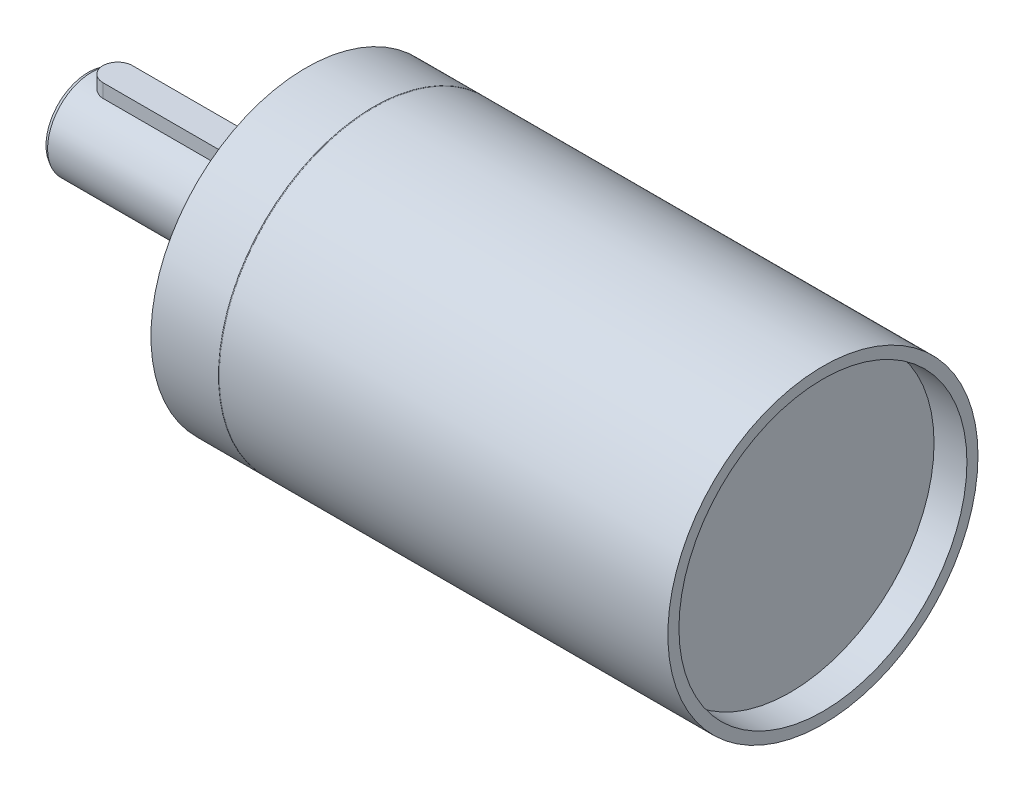
ISO-10303-21;
HEADER;
FILE_DESCRIPTION(('STEP AP214'),'2;1');
FILE_NAME('part.step','',(''),(''),'','','');
FILE_SCHEMA(('AUTOMOTIVE_DESIGN { 1 0 10303 214 1 1 1 1 }'));
ENDSEC;
DATA;
#1=APPLICATION_CONTEXT('core data for automotive mechanical design processes');
#2=APPLICATION_PROTOCOL_DEFINITION('international standard','automotive_design',2000,#1);
#3=PRODUCT_CONTEXT('',#1,'mechanical');
#4=PRODUCT('Part','Part','',(#3));
#5=PRODUCT_RELATED_PRODUCT_CATEGORY('part','',(#4));
#6=PRODUCT_DEFINITION_FORMATION('','',#4);
#7=PRODUCT_DEFINITION_CONTEXT('part definition',#1,'design');
#8=PRODUCT_DEFINITION('design','',#6,#7);
#9=PRODUCT_DEFINITION_SHAPE('','',#8);
#10=(LENGTH_UNIT() NAMED_UNIT(*) SI_UNIT(.MILLI.,.METRE.));
#11=(NAMED_UNIT(*) PLANE_ANGLE_UNIT() SI_UNIT($,.RADIAN.));
#12=(NAMED_UNIT(*) SI_UNIT($,.STERADIAN.) SOLID_ANGLE_UNIT());
#13=UNCERTAINTY_MEASURE_WITH_UNIT(LENGTH_MEASURE(1.E-05),#10,'distance_accuracy_value','');
#14=(GEOMETRIC_REPRESENTATION_CONTEXT(3) GLOBAL_UNCERTAINTY_ASSIGNED_CONTEXT((#13)) GLOBAL_UNIT_ASSIGNED_CONTEXT((#10,
#11,#12)) REPRESENTATION_CONTEXT('',''));
#15=CARTESIAN_POINT('',(0.,0.,0.));
#16=DIRECTION('',(0.,0.,1.));
#17=DIRECTION('',(1.,0.,0.));
#18=AXIS2_PLACEMENT_3D('',#15,#16,#17);
#19=CARTESIAN_POINT('',(-3.,0.,0.));
#20=DIRECTION('',(-1.,0.,0.));
#21=DIRECTION('',(0.,0.,1.));
#22=AXIS2_PLACEMENT_3D('',#19,#20,#21);
#23=PLANE('',#22);
#24=CARTESIAN_POINT('',(-3.,0.,0.));
#25=DIRECTION('',(-1.,0.,0.));
#26=DIRECTION('',(0.,0.,1.));
#27=AXIS2_PLACEMENT_3D('',#24,#25,#26);
#28=CIRCLE('',#27,14.);
#29=CARTESIAN_POINT('',(-3.,0.,14.));
#30=VERTEX_POINT('',#29);
#31=EDGE_CURVE('E288',#30,#30,#28,.T.);
#32=ORIENTED_EDGE('',*,*,#31,.T.);
#33=EDGE_LOOP('',(#32));
#34=FACE_BOUND('',#33,.T.);
#35=CARTESIAN_POINT('',(-3.,0.,0.));
#36=DIRECTION('',(-1.,0.,0.));
#37=DIRECTION('',(0.,0.,1.));
#38=AXIS2_PLACEMENT_3D('',#35,#36,#37);
#39=CIRCLE('',#38,6.);
#40=CARTESIAN_POINT('',(-3.,-5.99279677762809,-0.293916284085004));
#41=VERTEX_POINT('',#40);
#42=CARTESIAN_POINT('',(-3.,-5.99279677762809,0.293916284085002));
#43=VERTEX_POINT('',#42);
#44=EDGE_CURVE('E284',#41,#43,#39,.T.);
#45=ORIENTED_EDGE('',*,*,#44,.F.);
#46=DIRECTION('',(0.,1.,0.));
#47=VECTOR('',#46,1.);
#48=CARTESIAN_POINT('',(-3.,-5.99279677762809,-0.293916284085001));
#49=LINE('',#48,#47);
#50=CARTESIAN_POINT('',(-3.,-7.61683878137723,-0.293916284085002));
#51=VERTEX_POINT('',#50);
#52=EDGE_CURVE('E69',#51,#41,#49,.T.);
#53=ORIENTED_EDGE('',*,*,#52,.F.);
#54=CARTESIAN_POINT('',(-3.,-3.80484548733086,0.293916284084806));
#55=DIRECTION('',(-1.,0.,0.));
#56=DIRECTION('',(0.,0.,-1.));
#57=AXIS2_PLACEMENT_3D('',#54,#55,#56);
#58=CIRCLE('',#57,3.85705068699591);
#59=CARTESIAN_POINT('',(-3.,-5.99279677762799,-2.8825139690992));
#60=VERTEX_POINT('',#59);
#61=EDGE_CURVE('E263',#60,#51,#58,.T.);
#62=ORIENTED_EDGE('',*,*,#61,.F.);
#63=CARTESIAN_POINT('',(-3.,0.,0.));
#64=DIRECTION('',(-1.,0.,0.));
#65=DIRECTION('',(0.,0.,-1.));
#66=AXIS2_PLACEMENT_3D('',#63,#64,#65);
#67=CIRCLE('',#66,6.65000000000003);
#68=CARTESIAN_POINT('',(-3.,-5.99279677762799,2.88251396909925));
#69=VERTEX_POINT('',#68);
#70=EDGE_CURVE('E260',#69,#60,#67,.T.);
#71=ORIENTED_EDGE('',*,*,#70,.F.);
#72=CARTESIAN_POINT('',(-3.,-4.741805259079,0.293916284085));
#73=DIRECTION('',(-1.,0.,0.));
#74=DIRECTION('',(0.,0.,-1.));
#75=AXIS2_PLACEMENT_3D('',#72,#73,#74);
#76=CIRCLE('',#75,2.87503352229894);
#77=CARTESIAN_POINT('',(-3.,-7.616838781378,0.293916284085));
#78=VERTEX_POINT('',#77);
#79=EDGE_CURVE('E240',#78,#69,#76,.T.);
#80=ORIENTED_EDGE('',*,*,#79,.F.);
#81=DIRECTION('',(0.,-1.,0.));
#82=VECTOR('',#81,1.);
#83=CARTESIAN_POINT('',(-3.,-7.616838781378,0.293916284085));
#84=LINE('',#83,#82);
#85=EDGE_CURVE('E245',#43,#78,#84,.T.);
#86=ORIENTED_EDGE('',*,*,#85,.F.);
#87=EDGE_LOOP('',(#45,#53,#62,#71,#80,#86));
#88=FACE_BOUND('',#87,.T.);
#89=ADVANCED_FACE('F46',(#34,#88),#23,.T.);
#90=CARTESIAN_POINT('',(-29.5,0.,0.));
#91=DIRECTION('',(1.,0.,0.));
#92=DIRECTION('',(0.,0.,-1.));
#93=AXIS2_PLACEMENT_3D('',#90,#91,#92);
#94=CYLINDRICAL_SURFACE('',#93,6.);
#95=CARTESIAN_POINT('',(-29.0000000000346,0.,0.));
#96=DIRECTION('',(-1.,0.,0.));
#97=DIRECTION('',(0.,0.,1.));
#98=AXIS2_PLACEMENT_3D('',#95,#96,#97);
#99=CIRCLE('',#98,6.);
#100=CARTESIAN_POINT('',(-29.0000000000346,0.,6.));
#101=VERTEX_POINT('',#100);
#102=EDGE_CURVE('E13',#101,#101,#99,.F.);
#103=ORIENTED_EDGE('',*,*,#102,.T.);
#104=EDGE_LOOP('',(#103));
#105=FACE_BOUND('',#104,.T.);
#106=CARTESIAN_POINT('',(-25.5,5.65685424949238,-2.));
#107=CARTESIAN_POINT('',(-25.5545809936022,5.65684884188678,-2.0000014949184));
#108=CARTESIAN_POINT('',(-25.6091341243787,5.6576451988649,-1.99776424917478));
#109=CARTESIAN_POINT('',(-25.7178171681098,5.66078654578442,-1.9888512140728));
#110=CARTESIAN_POINT('',(-25.7719471913194,5.66313111768244,-1.98217662286705));
#111=CARTESIAN_POINT('',(-25.9327842863903,5.67238184449301,-1.95562135046158));
#112=CARTESIAN_POINT('',(-26.038361692541,5.6815058499903,-1.92920846605623));
#113=CARTESIAN_POINT('',(-26.2432503848876,5.70456149397718,-1.85991682366086));
#114=CARTESIAN_POINT('',(-26.3425650937458,5.71849047905858,-1.81704715197507));
#115=CARTESIAN_POINT('',(-26.5326796680109,5.74957574438921,-1.71614645792974));
#116=CARTESIAN_POINT('',(-26.6234742581347,5.76673400456216,-1.65810612564547));
#117=CARTESIAN_POINT('',(-26.7974404626491,5.80308960804095,-1.52610278704603));
#118=CARTESIAN_POINT('',(-26.8802297609252,5.82233755536618,-1.45164996064407));
#119=CARTESIAN_POINT('',(-27.0324120355834,5.86027697385956,-1.28997688598297));
#120=CARTESIAN_POINT('',(-27.1018026265119,5.87896834543705,-1.20275436910907));
#121=CARTESIAN_POINT('',(-27.2269590376084,5.91427765988454,-1.01520729191253));
#122=CARTESIAN_POINT('',(-27.2823219688045,5.93082875123708,-0.914600178716994));
#123=CARTESIAN_POINT('',(-27.3751845033745,5.95939217209317,-0.704858499931718));
#124=CARTESIAN_POINT('',(-27.4126895636409,5.97140588786619,-0.59572655118684));
#125=CARTESIAN_POINT('',(-27.4674714521827,5.98918142285845,-0.376058690956074));
#126=CARTESIAN_POINT('',(-27.4854065451074,5.99514617977147,-0.265703668920224));
#127=CARTESIAN_POINT('',(-27.5026325970512,6.00087216807634,-0.0433979389113466));
#128=CARTESIAN_POINT('',(-27.5019279985395,6.00063487762605,0.0685523824907838));
#129=CARTESIAN_POINT('',(-27.4823114337867,5.99412077270532,0.286207690558783));
#130=CARTESIAN_POINT('',(-27.4641147240811,5.98808121982527,0.391985405251071));
#131=CARTESIAN_POINT('',(-27.4112136026518,5.97093921001647,0.598888128753311));
#132=CARTESIAN_POINT('',(-27.3765082755875,5.95983647235462,0.700012879232927));
#133=CARTESIAN_POINT('',(-27.2911572607987,5.93351336542608,0.896305246061924));
#134=CARTESIAN_POINT('',(-27.2403079097553,5.91824075676625,0.991377011307983));
#135=CARTESIAN_POINT('',(-27.1242800972186,5.88516775360088,1.17184917819498));
#136=CARTESIAN_POINT('',(-27.059097737907,5.86736667195186,1.25724693942937));
#137=CARTESIAN_POINT('',(-26.9126579000063,5.83012543885479,1.42019467942243));
#138=CARTESIAN_POINT('',(-26.8307889127806,5.81064757359828,1.4971872232254));
#139=CARTESIAN_POINT('',(-26.6551170205677,5.77294980945702,1.63654404964077));
#140=CARTESIAN_POINT('',(-26.5613102751935,5.75473031831506,1.69890360636763));
#141=CARTESIAN_POINT('',(-26.3626396432934,5.72140062752635,1.80800665118557));
#142=CARTESIAN_POINT('',(-26.2576329701341,5.70634029896469,1.85450601901537));
#143=CARTESIAN_POINT('',(-26.0407060448201,5.68162194124078,1.92892046140223));
#144=CARTESIAN_POINT('',(-25.9287970132557,5.67195538817985,1.95686487211071));
#145=CARTESIAN_POINT('',(-25.763162726504,5.6627308418944,1.98331631256166));
#146=CARTESIAN_POINT('',(-25.7107172202915,5.66053335389204,1.98957012251023));
#147=CARTESIAN_POINT('',(-25.6055238432004,5.65759407142798,1.99790923214239));
#148=CARTESIAN_POINT('',(-25.5527764509112,5.65685039859056,1.99999991078996));
#149=CARTESIAN_POINT('',(-25.5,5.65685424949238,2.));
#150=B_SPLINE_CURVE_WITH_KNOTS('',3,(#106,#107,#108,#109,#110,#111,#112,#113,#114,#115,#116,
#117,#118,#119,#120,#121,#122,#123,#124,#125,#126,#127,#128,#129,#130,#131,#132,#133,#134,#135,
#136,#137,#138,#139,#140,#141,#142,#143,#144,#145,#146,#147,#148,#149),.UNSPECIFIED.,.F.,.F.,(4,
2,2,2,2,2,2,2,2,2,2,2,2,2,2,2,2,2,2,2,2,4),(0.,0.163636969470864,0.327229772338923,
0.653162396790745,0.97891532193247,1.30486862627062,1.64233009925355,1.97985159727495,
2.32618265866202,2.67240782242255,3.00658941454806,3.34069136061284,3.6616883693147,
3.98270317816496,4.30794037651935,4.63326613177537,4.97388108116101,5.31460588498485,
5.6603605985608,6.00556734973678,6.16399790665503,6.32222363058113),.UNSPECIFIED.);
#151=CARTESIAN_POINT('',(-25.5,5.65685424949238,-2.));
#152=VERTEX_POINT('',#151);
#153=CARTESIAN_POINT('',(-25.5,5.65685424949238,2.));
#154=VERTEX_POINT('',#153);
#155=EDGE_CURVE('E214',#152,#154,#150,.T.);
#156=ORIENTED_EDGE('',*,*,#155,.F.);
#157=DIRECTION('',(1.,0.,0.));
#158=VECTOR('',#157,1.);
#159=CARTESIAN_POINT('',(-29.5,5.65685424949238,-2.));
#160=LINE('',#159,#158);
#161=CARTESIAN_POINT('',(-9.5,5.65685424948015,-2.));
#162=VERTEX_POINT('',#161);
#163=EDGE_CURVE('E221',#162,#152,#160,.F.);
#164=ORIENTED_EDGE('',*,*,#163,.F.);
#165=CARTESIAN_POINT('',(-9.5,5.65685424949238,2.));
#166=CARTESIAN_POINT('',(-9.44541900639777,5.65684884188678,2.0000014949184));
#167=CARTESIAN_POINT('',(-9.39086587562134,5.6576451988649,1.99776424917478));
#168=CARTESIAN_POINT('',(-9.28218283189021,5.66078654578442,1.9888512140728));
#169=CARTESIAN_POINT('',(-9.22805280868061,5.66313111768244,1.98217662286705));
#170=CARTESIAN_POINT('',(-9.06721571360973,5.67238184449301,1.95562135046158));
#171=CARTESIAN_POINT('',(-8.96163830745905,5.6815058499903,1.92920846605623));
#172=CARTESIAN_POINT('',(-8.75674961511245,5.70456149397718,1.85991682366086));
#173=CARTESIAN_POINT('',(-8.65743490625416,5.71849047905858,1.81704715197507));
#174=CARTESIAN_POINT('',(-8.46732033198908,5.74957574438921,1.71614645792974));
#175=CARTESIAN_POINT('',(-8.37652574186531,5.76673400456216,1.65810612564547));
#176=CARTESIAN_POINT('',(-8.20255953735094,5.80308960804095,1.52610278704603));
#177=CARTESIAN_POINT('',(-8.11977023907478,5.82233755536618,1.45164996064408));
#178=CARTESIAN_POINT('',(-7.96758796441661,5.86027697385956,1.28997688598297));
#179=CARTESIAN_POINT('',(-7.89819737348812,5.87896834543705,1.20275436910907));
#180=CARTESIAN_POINT('',(-7.77304096239161,5.91427765988454,1.01520729191253));
#181=CARTESIAN_POINT('',(-7.71767803119549,5.93082875123708,0.914600178716996));
#182=CARTESIAN_POINT('',(-7.62481549662547,5.95939217209316,0.704858499931721));
#183=CARTESIAN_POINT('',(-7.58731043635913,5.97140588786619,0.595726551186843));
#184=CARTESIAN_POINT('',(-7.53252854781725,5.98918142285845,0.376058690956076));
#185=CARTESIAN_POINT('',(-7.51459345489264,5.99514617977147,0.265703668920226));
#186=CARTESIAN_POINT('',(-7.49736740294878,6.00087216807634,0.0433979389113482));
#187=CARTESIAN_POINT('',(-7.4980720014605,6.00063487762605,-0.0685523824907828));
#188=CARTESIAN_POINT('',(-7.51768856621331,5.99412077270532,-0.286207690558783));
#189=CARTESIAN_POINT('',(-7.53588527591893,5.98808121982527,-0.391985405251071));
#190=CARTESIAN_POINT('',(-7.58878639734824,5.97093921001647,-0.598888128753311));
#191=CARTESIAN_POINT('',(-7.6234917244125,5.95983647235462,-0.700012879232927));
#192=CARTESIAN_POINT('',(-7.70884273920126,5.93351336542608,-0.896305246061923));
#193=CARTESIAN_POINT('',(-7.75969209024468,5.91824075676625,-0.991377011307982));
#194=CARTESIAN_POINT('',(-7.8757199027814,5.88516775360088,-1.17184917819498));
#195=CARTESIAN_POINT('',(-7.94090226209303,5.86736667195186,-1.25724693942937));
#196=CARTESIAN_POINT('',(-8.08734209999369,5.83012543885479,-1.42019467942242));
#197=CARTESIAN_POINT('',(-8.16921108721941,5.81064757359828,-1.4971872232254));
#198=CARTESIAN_POINT('',(-8.34488297943233,5.77294980945702,-1.63654404964077));
#199=CARTESIAN_POINT('',(-8.43868972480648,5.75473031831506,-1.69890360636763));
#200=CARTESIAN_POINT('',(-8.63736035670656,5.72140062752635,-1.80800665118557));
#201=CARTESIAN_POINT('',(-8.74236702986588,5.70634029896469,-1.85450601901537));
#202=CARTESIAN_POINT('',(-8.95929395517991,5.68162194124078,-1.92892046140223));
#203=CARTESIAN_POINT('',(-9.0712029867443,5.67195538817985,-1.95686487211071));
#204=CARTESIAN_POINT('',(-9.23683727349596,5.6627308418944,-1.98331631256166));
#205=CARTESIAN_POINT('',(-9.28928277970846,5.66053335389204,-1.98957012251023));
#206=CARTESIAN_POINT('',(-9.39447615679962,5.65759407142798,-1.99790923214239));
#207=CARTESIAN_POINT('',(-9.44722354908881,5.65685039859056,-1.99999991078996));
#208=CARTESIAN_POINT('',(-9.5,5.65685424949238,-2.));
#209=B_SPLINE_CURVE_WITH_KNOTS('',3,(#165,#166,#167,#168,#169,#170,#171,#172,#173,#174,#175,
#176,#177,#178,#179,#180,#181,#182,#183,#184,#185,#186,#187,#188,#189,#190,#191,#192,#193,#194,
#195,#196,#197,#198,#199,#200,#201,#202,#203,#204,#205,#206,#207,#208),.UNSPECIFIED.,.F.,.F.,(4,
2,2,2,2,2,2,2,2,2,2,2,2,2,2,2,2,2,2,2,2,4),(0.,0.163636969470865,0.327229772338922,
0.653162396790745,0.978915321932472,1.30486862627062,1.64233009925355,1.97985159727495,
2.32618265866202,2.67240782242254,3.00658941454806,3.34069136061284,3.6616883693147,
3.98270317816496,4.30794037651935,4.63326613177537,4.973881081161,5.31460588498484,
5.6603605985608,6.00556734973678,6.16399790665503,6.32222363058113),.UNSPECIFIED.);
#210=CARTESIAN_POINT('',(-9.5,5.65685424948015,2.));
#211=VERTEX_POINT('',#210);
#212=EDGE_CURVE('E235',#211,#162,#209,.T.);
#213=ORIENTED_EDGE('',*,*,#212,.F.);
#214=DIRECTION('',(1.,0.,0.));
#215=VECTOR('',#214,1.);
#216=CARTESIAN_POINT('',(-29.5,5.65685424949238,2.));
#217=LINE('',#216,#215);
#218=EDGE_CURVE('E212',#154,#211,#217,.T.);
#219=ORIENTED_EDGE('',*,*,#218,.F.);
#220=EDGE_LOOP('',(#156,#164,#213,#219));
#221=FACE_BOUND('',#220,.T.);
#222=DIRECTION('',(1.,0.,0.));
#223=VECTOR('',#222,1.);
#224=CARTESIAN_POINT('',(-4.,-5.99279677762809,-0.293916284085004));
#225=LINE('',#224,#223);
#226=CARTESIAN_POINT('',(-4.,-5.99279677762809,-0.293916284085001));
#227=VERTEX_POINT('',#226);
#228=EDGE_CURVE('E273',#227,#41,#225,.T.);
#229=ORIENTED_EDGE('',*,*,#228,.T.);
#230=ORIENTED_EDGE('',*,*,#44,.T.);
#231=DIRECTION('',(1.,0.,0.));
#232=VECTOR('',#231,1.);
#233=CARTESIAN_POINT('',(-4.,-5.99279677762809,0.293916284085002));
#234=LINE('',#233,#232);
#235=CARTESIAN_POINT('',(-4.,-5.99279677762809,0.293916284085002));
#236=VERTEX_POINT('',#235);
#237=EDGE_CURVE('E270',#236,#43,#234,.T.);
#238=ORIENTED_EDGE('',*,*,#237,.F.);
#239=CARTESIAN_POINT('',(-4.,0.,0.));
#240=DIRECTION('',(1.,0.,0.));
#241=DIRECTION('',(0.,0.,1.));
#242=AXIS2_PLACEMENT_3D('',#239,#240,#241);
#243=CIRCLE('',#242,6.);
#244=EDGE_CURVE('E252',#227,#236,#243,.T.);
#245=ORIENTED_EDGE('',*,*,#244,.F.);
#246=EDGE_LOOP('',(#229,#230,#238,#245));
#247=FACE_BOUND('',#246,.T.);
#248=ADVANCED_FACE('F320',(#105,#221,#247),#94,.T.);
#249=CARTESIAN_POINT('',(0.,1.16808307098715E-12,0.));
#250=DIRECTION('',(1.,0.,0.));
#251=DIRECTION('',(0.,0.,-1.));
#252=AXIS2_PLACEMENT_3D('',#249,#250,#251);
#253=CYLINDRICAL_SURFACE('',#252,20.9999999999999);
#254=CARTESIAN_POINT('',(0.,1.16808307098715E-12,0.));
#255=DIRECTION('',(1.,0.,0.));
#256=DIRECTION('',(0.,0.,-1.));
#257=AXIS2_PLACEMENT_3D('',#254,#255,#256);
#258=CIRCLE('',#257,21.);
#259=CARTESIAN_POINT('',(0.,1.16808307098715E-12,-21.));
#260=VERTEX_POINT('',#259);
#261=EDGE_CURVE('E291',#260,#260,#258,.T.);
#262=ORIENTED_EDGE('',*,*,#261,.T.);
#263=EDGE_LOOP('',(#262));
#264=FACE_BOUND('',#263,.T.);
#265=CARTESIAN_POINT('',(9.15000000000059,1.16808307098715E-12,0.));
#266=DIRECTION('',(1.,0.,0.));
#267=DIRECTION('',(0.,0.,-1.));
#268=AXIS2_PLACEMENT_3D('',#265,#266,#267);
#269=CIRCLE('',#268,20.9999999999999);
#270=CARTESIAN_POINT('',(9.15000000000059,1.16808307098715E-12,-20.9999999999999));
#271=VERTEX_POINT('',#270);
#272=EDGE_CURVE('E302',#271,#271,#269,.T.);
#273=ORIENTED_EDGE('',*,*,#272,.F.);
#274=EDGE_LOOP('',(#273));
#275=FACE_BOUND('',#274,.T.);
#276=ADVANCED_FACE('F326',(#264,#275),#253,.T.);
#277=CARTESIAN_POINT('',(9.2,1.16920362280837E-12,0.));
#278=DIRECTION('',(1.,0.,0.));
#279=DIRECTION('',(0.,0.,-1.));
#280=AXIS2_PLACEMENT_3D('',#277,#278,#279);
#281=TOROIDAL_SURFACE('',#280,21.0866025403788,0.100000000000167);
#282=ORIENTED_EDGE('',*,*,#272,.T.);
#283=EDGE_LOOP('',(#282));
#284=FACE_BOUND('',#283,.T.);
#285=CARTESIAN_POINT('',(9.25,1.16808307098715E-12,0.));
#286=DIRECTION('',(1.,0.,0.));
#287=DIRECTION('',(0.,0.,-1.));
#288=AXIS2_PLACEMENT_3D('',#285,#286,#287);
#289=CIRCLE('',#288,21.);
#290=CARTESIAN_POINT('',(9.25,1.16808307098715E-12,-21.));
#291=VERTEX_POINT('',#290);
#292=EDGE_CURVE('E299',#291,#291,#289,.T.);
#293=ORIENTED_EDGE('',*,*,#292,.F.);
#294=EDGE_LOOP('',(#293));
#295=FACE_BOUND('',#294,.T.);
#296=ADVANCED_FACE('F346',(#284,#295),#281,.F.);
#297=CARTESIAN_POINT('',(0.,1.16808307098715E-12,0.));
#298=DIRECTION('',(1.,0.,0.));
#299=DIRECTION('',(0.,0.,-1.));
#300=AXIS2_PLACEMENT_3D('',#297,#298,#299);
#301=CYLINDRICAL_SURFACE('',#300,21.);
#302=ORIENTED_EDGE('',*,*,#292,.T.);
#303=EDGE_LOOP('',(#302));
#304=FACE_BOUND('',#303,.T.);
#305=CARTESIAN_POINT('',(70.,1.16808307098715E-12,0.));
#306=DIRECTION('',(1.,0.,0.));
#307=DIRECTION('',(0.,0.,-1.));
#308=AXIS2_PLACEMENT_3D('',#305,#306,#307);
#309=CIRCLE('',#308,21.);
#310=CARTESIAN_POINT('',(70.,1.16808307098715E-12,-21.));
#311=VERTEX_POINT('',#310);
#312=EDGE_CURVE('E296',#311,#311,#309,.T.);
#313=ORIENTED_EDGE('',*,*,#312,.F.);
#314=EDGE_LOOP('',(#313));
#315=FACE_BOUND('',#314,.T.);
#316=ADVANCED_FACE('F342',(#304,#315),#301,.T.);
#317=CARTESIAN_POINT('',(70.,1.16808307098715E-12,0.));
#318=DIRECTION('',(1.,0.,0.));
#319=DIRECTION('',(0.,0.,-1.));
#320=AXIS2_PLACEMENT_3D('',#317,#318,#319);
#321=PLANE('',#320);
#322=CARTESIAN_POINT('',(70.,0.,0.));
#323=DIRECTION('',(1.,0.,0.));
#324=DIRECTION('',(0.,0.,-1.));
#325=AXIS2_PLACEMENT_3D('',#322,#323,#324);
#326=CIRCLE('',#325,19.5);
#327=CARTESIAN_POINT('',(70.,0.,-19.5));
#328=VERTEX_POINT('',#327);
#329=EDGE_CURVE('E187',#328,#328,#326,.T.);
#330=ORIENTED_EDGE('',*,*,#329,.F.);
#331=EDGE_LOOP('',(#330));
#332=FACE_BOUND('',#331,.T.);
#333=ORIENTED_EDGE('',*,*,#312,.T.);
#334=EDGE_LOOP('',(#333));
#335=FACE_BOUND('',#334,.T.);
#336=ADVANCED_FACE('F338',(#332,#335),#321,.T.);
#337=CARTESIAN_POINT('',(0.,21.0000000000012,0.));
#338=DIRECTION('',(-1.,0.,0.));
#339=DIRECTION('',(0.,0.,1.));
#340=AXIS2_PLACEMENT_3D('',#337,#338,#339);
#341=PLANE('',#340);
#342=CARTESIAN_POINT('',(0.,17.49999999997,3.054326190989E-05));
#343=DIRECTION('',(-1.,0.,0.));
#344=DIRECTION('',(0.,0.,1.));
#345=AXIS2_PLACEMENT_3D('',#342,#343,#344);
#346=CIRCLE('',#345,1.64999999999999);
#347=CARTESIAN_POINT('',(0.,17.49999999997,1.6500305432619));
#348=VERTEX_POINT('',#347);
#349=EDGE_CURVE('E150',#348,#348,#346,.T.);
#350=ORIENTED_EDGE('',*,*,#349,.F.);
#351=EDGE_LOOP('',(#350));
#352=FACE_BOUND('',#351,.T.);
#353=CARTESIAN_POINT('',(0.,-3.054326190881E-05,17.49999999997));
#354=DIRECTION('',(-1.,0.,0.));
#355=DIRECTION('',(0.,0.,1.));
#356=AXIS2_PLACEMENT_3D('',#353,#354,#355);
#357=CIRCLE('',#356,1.64999999999999);
#358=CARTESIAN_POINT('',(0.,-3.054326190881E-05,19.14999999997));
#359=VERTEX_POINT('',#358);
#360=EDGE_CURVE('E163',#359,#359,#357,.T.);
#361=ORIENTED_EDGE('',*,*,#360,.F.);
#362=EDGE_LOOP('',(#361));
#363=FACE_BOUND('',#362,.T.);
#364=CARTESIAN_POINT('',(0.,-17.49999999997,-3.054326190774E-05));
#365=DIRECTION('',(-1.,0.,0.));
#366=DIRECTION('',(0.,0.,1.));
#367=AXIS2_PLACEMENT_3D('',#364,#365,#366);
#368=CIRCLE('',#367,1.64999999999999);
#369=CARTESIAN_POINT('',(0.,-17.49999999997,1.64996945673808));
#370=VERTEX_POINT('',#369);
#371=EDGE_CURVE('E169',#370,#370,#368,.T.);
#372=ORIENTED_EDGE('',*,*,#371,.F.);
#373=EDGE_LOOP('',(#372));
#374=FACE_BOUND('',#373,.T.);
#375=CARTESIAN_POINT('',(0.,3.054326190667E-05,-17.49999999997));
#376=DIRECTION('',(-1.,0.,0.));
#377=DIRECTION('',(0.,0.,1.));
#378=AXIS2_PLACEMENT_3D('',#375,#376,#377);
#379=CIRCLE('',#378,1.64999999999999);
#380=CARTESIAN_POINT('',(0.,3.054326190667E-05,-15.84999999997));
#381=VERTEX_POINT('',#380);
#382=EDGE_CURVE('E175',#381,#381,#379,.T.);
#383=ORIENTED_EDGE('',*,*,#382,.F.);
#384=EDGE_LOOP('',(#383));
#385=FACE_BOUND('',#384,.T.);
#386=CARTESIAN_POINT('',(0.,18.01565088397,-7.462326931119));
#387=DIRECTION('',(-1.,0.,0.));
#388=DIRECTION('',(0.,0.,1.));
#389=AXIS2_PLACEMENT_3D('',#386,#387,#388);
#390=CIRCLE('',#389,0.74999999999999);
#391=CARTESIAN_POINT('',(0.,18.01565088397,-6.71232693111901));
#392=VERTEX_POINT('',#391);
#393=EDGE_CURVE('E181',#392,#392,#390,.T.);
#394=ORIENTED_EDGE('',*,*,#393,.F.);
#395=EDGE_LOOP('',(#394));
#396=FACE_BOUND('',#395,.T.);
#397=CARTESIAN_POINT('',(0.,0.,0.));
#398=DIRECTION('',(-1.,0.,0.));
#399=DIRECTION('',(0.,0.,1.));
#400=AXIS2_PLACEMENT_3D('',#397,#398,#399);
#401=CIRCLE('',#400,14.);
#402=CARTESIAN_POINT('',(0.,0.,14.));
#403=VERTEX_POINT('',#402);
#404=EDGE_CURVE('E287',#403,#403,#401,.T.);
#405=ORIENTED_EDGE('',*,*,#404,.F.);
#406=EDGE_LOOP('',(#405));
#407=FACE_BOUND('',#406,.T.);
#408=ORIENTED_EDGE('',*,*,#261,.F.);
#409=EDGE_LOOP('',(#408));
#410=FACE_BOUND('',#409,.T.);
#411=ADVANCED_FACE('F334',(#352,#363,#374,#385,#396,#407,#410),#341,.T.);
#412=CARTESIAN_POINT('',(-3.,0.,0.));
#413=DIRECTION('',(1.,0.,0.));
#414=DIRECTION('',(0.,0.,-1.));
#415=AXIS2_PLACEMENT_3D('',#412,#413,#414);
#416=CYLINDRICAL_SURFACE('',#415,14.);
#417=ORIENTED_EDGE('',*,*,#31,.F.);
#418=EDGE_LOOP('',(#417));
#419=FACE_BOUND('',#418,.T.);
#420=ORIENTED_EDGE('',*,*,#404,.T.);
#421=EDGE_LOOP('',(#420));
#422=FACE_BOUND('',#421,.T.);
#423=ADVANCED_FACE('F331',(#419,#422),#416,.T.);
#424=CARTESIAN_POINT('',(-29.5,0.,0.));
#425=DIRECTION('',(-1.,0.,0.));
#426=DIRECTION('',(0.,0.,1.));
#427=AXIS2_PLACEMENT_3D('',#424,#425,#426);
#428=PLANE('',#427);
#429=CARTESIAN_POINT('',(-29.5,0.,0.));
#430=DIRECTION('',(-1.,0.,0.));
#431=DIRECTION('',(0.,0.,1.));
#432=AXIS2_PLACEMENT_3D('',#429,#430,#431);
#433=CIRCLE('',#432,5.71132486542906);
#434=CARTESIAN_POINT('',(-29.5,0.,5.71132486542906));
#435=VERTEX_POINT('',#434);
#436=EDGE_CURVE('E54',#435,#435,#433,.T.);
#437=ORIENTED_EDGE('',*,*,#436,.T.);
#438=EDGE_LOOP('',(#437));
#439=FACE_BOUND('',#438,.T.);
#440=CARTESIAN_POINT('',(-29.5,0.,0.));
#441=DIRECTION('',(-1.,0.,0.));
#442=DIRECTION('',(0.,0.,1.));
#443=AXIS2_PLACEMENT_3D('',#440,#441,#442);
#444=CIRCLE('',#443,1.32500000000846);
#445=CARTESIAN_POINT('',(-29.5,0.,1.32500000000846));
#446=VERTEX_POINT('',#445);
#447=EDGE_CURVE('E157',#446,#446,#444,.T.);
#448=ORIENTED_EDGE('',*,*,#447,.F.);
#449=EDGE_LOOP('',(#448));
#450=FACE_BOUND('',#449,.T.);
#451=ADVANCED_FACE('F307',(#439,#450),#428,.T.);
#452=CARTESIAN_POINT('',(-4.,-4.741805259079,0.293916284085));
#453=DIRECTION('',(1.,0.,0.));
#454=DIRECTION('',(0.,0.,-1.));
#455=AXIS2_PLACEMENT_3D('',#452,#453,#454);
#456=CYLINDRICAL_SURFACE('',#455,2.87503352229894);
#457=ORIENTED_EDGE('',*,*,#79,.T.);
#458=DIRECTION('',(1.,0.,0.));
#459=VECTOR('',#458,1.);
#460=CARTESIAN_POINT('',(-4.,-5.99279677762798,2.88251396909922));
#461=LINE('',#460,#459);
#462=CARTESIAN_POINT('',(-4.,-5.99279677762798,2.88251396909922));
#463=VERTEX_POINT('',#462);
#464=EDGE_CURVE('E281',#463,#69,#461,.T.);
#465=ORIENTED_EDGE('',*,*,#464,.F.);
#466=CARTESIAN_POINT('',(-4.,-4.741805259079,0.293916284085));
#467=DIRECTION('',(-1.,0.,0.));
#468=DIRECTION('',(0.,0.,-1.));
#469=AXIS2_PLACEMENT_3D('',#466,#467,#468);
#470=CIRCLE('',#469,2.87503352229894);
#471=CARTESIAN_POINT('',(-4.,-7.616838781378,0.293916284085));
#472=VERTEX_POINT('',#471);
#473=EDGE_CURVE('E241',#472,#463,#470,.T.);
#474=ORIENTED_EDGE('',*,*,#473,.F.);
#475=DIRECTION('',(1.,0.,0.));
#476=VECTOR('',#475,1.);
#477=CARTESIAN_POINT('',(-4.,-7.616838781378,0.293916284085));
#478=LINE('',#477,#476);
#479=EDGE_CURVE('E257',#472,#78,#478,.T.);
#480=ORIENTED_EDGE('',*,*,#479,.T.);
#481=EDGE_LOOP('',(#457,#465,#474,#480));
#482=FACE_BOUND('',#481,.T.);
#483=ADVANCED_FACE('F395',(#482),#456,.T.);
#484=CARTESIAN_POINT('',(-4.,0.,0.));
#485=DIRECTION('',(1.,0.,0.));
#486=DIRECTION('',(0.,0.,-1.));
#487=AXIS2_PLACEMENT_3D('',#484,#485,#486);
#488=CYLINDRICAL_SURFACE('',#487,6.65000000000003);
#489=ORIENTED_EDGE('',*,*,#70,.T.);
#490=DIRECTION('',(1.,0.,0.));
#491=VECTOR('',#490,1.);
#492=CARTESIAN_POINT('',(-4.,-5.992796777628,-2.88251396909921));
#493=LINE('',#492,#491);
#494=CARTESIAN_POINT('',(-4.,-5.992796777628,-2.88251396909921));
#495=VERTEX_POINT('',#494);
#496=EDGE_CURVE('E278',#495,#60,#493,.T.);
#497=ORIENTED_EDGE('',*,*,#496,.F.);
#498=CARTESIAN_POINT('',(-4.,0.,0.));
#499=DIRECTION('',(-1.,0.,0.));
#500=DIRECTION('',(0.,0.,-1.));
#501=AXIS2_PLACEMENT_3D('',#498,#499,#500);
#502=CIRCLE('',#501,6.65000000000003);
#503=EDGE_CURVE('E244',#463,#495,#502,.T.);
#504=ORIENTED_EDGE('',*,*,#503,.F.);
#505=ORIENTED_EDGE('',*,*,#464,.T.);
#506=EDGE_LOOP('',(#489,#497,#504,#505));
#507=FACE_BOUND('',#506,.T.);
#508=ADVANCED_FACE('F401',(#507),#488,.T.);
#509=CARTESIAN_POINT('',(-4.,-3.80484548733086,0.293916284084806));
#510=DIRECTION('',(1.,0.,0.));
#511=DIRECTION('',(0.,0.,-1.));
#512=AXIS2_PLACEMENT_3D('',#509,#510,#511);
#513=CYLINDRICAL_SURFACE('',#512,3.85705068699591);
#514=ORIENTED_EDGE('',*,*,#61,.T.);
#515=DIRECTION('',(1.,0.,0.));
#516=VECTOR('',#515,1.);
#517=CARTESIAN_POINT('',(-4.,-7.61683878137722,-0.293916284085));
#518=LINE('',#517,#516);
#519=CARTESIAN_POINT('',(-4.,-7.61683878137722,-0.293916284085));
#520=VERTEX_POINT('',#519);
#521=EDGE_CURVE('E275',#520,#51,#518,.T.);
#522=ORIENTED_EDGE('',*,*,#521,.F.);
#523=CARTESIAN_POINT('',(-4.,-3.80484548733086,0.293916284084806));
#524=DIRECTION('',(-1.,0.,0.));
#525=DIRECTION('',(0.,0.,-1.));
#526=AXIS2_PLACEMENT_3D('',#523,#524,#525);
#527=CIRCLE('',#526,3.85705068699591);
#528=EDGE_CURVE('E247',#495,#520,#527,.T.);
#529=ORIENTED_EDGE('',*,*,#528,.F.);
#530=ORIENTED_EDGE('',*,*,#496,.T.);
#531=EDGE_LOOP('',(#514,#522,#529,#530));
#532=FACE_BOUND('',#531,.T.);
#533=ADVANCED_FACE('F409',(#532),#513,.T.);
#534=CARTESIAN_POINT('',(-4.,-5.99279677762809,-0.293916284085001));
#535=DIRECTION('',(0.,0.,-1.));
#536=DIRECTION('',(0.,1.,0.));
#537=AXIS2_PLACEMENT_3D('',#534,#535,#536);
#538=PLANE('',#537);
#539=ORIENTED_EDGE('',*,*,#52,.T.);
#540=ORIENTED_EDGE('',*,*,#228,.F.);
#541=DIRECTION('',(0.,1.,0.));
#542=VECTOR('',#541,1.);
#543=CARTESIAN_POINT('',(-4.,-5.99279677762809,-0.293916284085001));
#544=LINE('',#543,#542);
#545=EDGE_CURVE('E249',#520,#227,#544,.T.);
#546=ORIENTED_EDGE('',*,*,#545,.F.);
#547=ORIENTED_EDGE('',*,*,#521,.T.);
#548=EDGE_LOOP('',(#539,#540,#546,#547));
#549=FACE_BOUND('',#548,.T.);
#550=ADVANCED_FACE('F417',(#549),#538,.F.);
#551=CARTESIAN_POINT('',(-4.,-7.616838781378,0.293916284085));
#552=DIRECTION('',(0.,0.,1.));
#553=DIRECTION('',(0.,-1.,0.));
#554=AXIS2_PLACEMENT_3D('',#551,#552,#553);
#555=PLANE('',#554);
#556=ORIENTED_EDGE('',*,*,#85,.T.);
#557=ORIENTED_EDGE('',*,*,#479,.F.);
#558=DIRECTION('',(0.,-1.,0.));
#559=VECTOR('',#558,1.);
#560=CARTESIAN_POINT('',(-4.,-7.616838781378,0.293916284085));
#561=LINE('',#560,#559);
#562=EDGE_CURVE('E255',#236,#472,#561,.T.);
#563=ORIENTED_EDGE('',*,*,#562,.F.);
#564=ORIENTED_EDGE('',*,*,#237,.T.);
#565=EDGE_LOOP('',(#556,#557,#563,#564));
#566=FACE_BOUND('',#565,.T.);
#567=ADVANCED_FACE('F425',(#566),#555,.F.);
#568=CARTESIAN_POINT('',(-4.,-4.741805259079,0.293916284085));
#569=DIRECTION('',(1.,0.,0.));
#570=DIRECTION('',(0.,0.,-1.));
#571=AXIS2_PLACEMENT_3D('',#568,#569,#570);
#572=PLANE('',#571);
#573=ORIENTED_EDGE('',*,*,#473,.T.);
#574=ORIENTED_EDGE('',*,*,#503,.T.);
#575=ORIENTED_EDGE('',*,*,#528,.T.);
#576=ORIENTED_EDGE('',*,*,#545,.T.);
#577=ORIENTED_EDGE('',*,*,#244,.T.);
#578=ORIENTED_EDGE('',*,*,#562,.T.);
#579=EDGE_LOOP('',(#573,#574,#575,#576,#577,#578));
#580=FACE_BOUND('',#579,.T.);
#581=ADVANCED_FACE('F232',(#580),#572,.F.);
#582=CARTESIAN_POINT('',(-9.5,-500000.,-2.));
#583=DIRECTION('',(0.,0.,-1.));
#584=DIRECTION('',(-1.,0.,0.));
#585=AXIS2_PLACEMENT_3D('',#582,#583,#584);
#586=PLANE('',#585);
#587=DIRECTION('',(0.,1.,0.));
#588=VECTOR('',#587,1.);
#589=CARTESIAN_POINT('',(-9.5,-500000.,-2.));
#590=LINE('',#589,#588);
#591=CARTESIAN_POINT('',(-9.5,7.5,-2.));
#592=VERTEX_POINT('',#591);
#593=EDGE_CURVE('E210',#162,#592,#590,.T.);
#594=ORIENTED_EDGE('',*,*,#593,.F.);
#595=ORIENTED_EDGE('',*,*,#163,.T.);
#596=DIRECTION('',(0.,1.,0.));
#597=VECTOR('',#596,1.);
#598=CARTESIAN_POINT('',(-25.5,-500000.,-2.));
#599=LINE('',#598,#597);
#600=CARTESIAN_POINT('',(-25.5,7.5,-2.));
#601=VERTEX_POINT('',#600);
#602=EDGE_CURVE('E208',#152,#601,#599,.T.);
#603=ORIENTED_EDGE('',*,*,#602,.T.);
#604=DIRECTION('',(-1.,0.,0.));
#605=VECTOR('',#604,1.);
#606=CARTESIAN_POINT('',(-9.5,7.5,-2.));
#607=LINE('',#606,#605);
#608=EDGE_CURVE('E194',#592,#601,#607,.T.);
#609=ORIENTED_EDGE('',*,*,#608,.F.);
#610=EDGE_LOOP('',(#594,#595,#603,#609));
#611=FACE_BOUND('',#610,.T.);
#612=ADVANCED_FACE('F439',(#611),#586,.T.);
#613=CARTESIAN_POINT('',(-9.5,7.5,0.));
#614=DIRECTION('',(0.,1.,0.));
#615=DIRECTION('',(0.,0.,1.));
#616=AXIS2_PLACEMENT_3D('',#613,#614,#615);
#617=PLANE('',#616);
#618=CARTESIAN_POINT('',(-9.5,7.5,0.));
#619=DIRECTION('',(0.,1.,0.));
#620=DIRECTION('',(0.,0.,1.));
#621=AXIS2_PLACEMENT_3D('',#618,#619,#620);
#622=CIRCLE('',#621,2.);
#623=CARTESIAN_POINT('',(-9.5,7.5,2.));
#624=VERTEX_POINT('',#623);
#625=EDGE_CURVE('E193',#624,#592,#622,.T.);
#626=ORIENTED_EDGE('',*,*,#625,.T.);
#627=ORIENTED_EDGE('',*,*,#608,.T.);
#628=CARTESIAN_POINT('',(-25.5,7.5,0.));
#629=DIRECTION('',(0.,1.,0.));
#630=DIRECTION('',(0.,0.,1.));
#631=AXIS2_PLACEMENT_3D('',#628,#629,#630);
#632=CIRCLE('',#631,2.);
#633=CARTESIAN_POINT('',(-25.5,7.5,2.));
#634=VERTEX_POINT('',#633);
#635=EDGE_CURVE('E197',#601,#634,#632,.T.);
#636=ORIENTED_EDGE('',*,*,#635,.T.);
#637=DIRECTION('',(1.,0.,0.));
#638=VECTOR('',#637,1.);
#639=CARTESIAN_POINT('',(-25.5,7.5,2.));
#640=LINE('',#639,#638);
#641=EDGE_CURVE('E200',#634,#624,#640,.T.);
#642=ORIENTED_EDGE('',*,*,#641,.T.);
#643=EDGE_LOOP('',(#626,#627,#636,#642));
#644=FACE_BOUND('',#643,.T.);
#645=ADVANCED_FACE('F447',(#644),#617,.T.);
#646=CARTESIAN_POINT('',(-9.5,-500000.,0.));
#647=DIRECTION('',(0.,1.,0.));
#648=DIRECTION('',(0.,0.,1.));
#649=AXIS2_PLACEMENT_3D('',#646,#647,#648);
#650=CYLINDRICAL_SURFACE('',#649,2.);
#651=DIRECTION('',(0.,1.,0.));
#652=VECTOR('',#651,1.);
#653=CARTESIAN_POINT('',(-9.5,-500000.,2.));
#654=LINE('',#653,#652);
#655=EDGE_CURVE('E203',#211,#624,#654,.T.);
#656=ORIENTED_EDGE('',*,*,#655,.F.);
#657=ORIENTED_EDGE('',*,*,#212,.T.);
#658=ORIENTED_EDGE('',*,*,#593,.T.);
#659=ORIENTED_EDGE('',*,*,#625,.F.);
#660=EDGE_LOOP('',(#656,#657,#658,#659));
#661=FACE_BOUND('',#660,.T.);
#662=ADVANCED_FACE('F230',(#661),#650,.T.);
#663=CARTESIAN_POINT('',(-25.5,-500000.,0.));
#664=DIRECTION('',(0.,1.,0.));
#665=DIRECTION('',(0.,0.,1.));
#666=AXIS2_PLACEMENT_3D('',#663,#664,#665);
#667=CYLINDRICAL_SURFACE('',#666,2.);
#668=ORIENTED_EDGE('',*,*,#602,.F.);
#669=ORIENTED_EDGE('',*,*,#155,.T.);
#670=DIRECTION('',(0.,1.,0.));
#671=VECTOR('',#670,1.);
#672=CARTESIAN_POINT('',(-25.5,-500000.,2.));
#673=LINE('',#672,#671);
#674=EDGE_CURVE('E61',#154,#634,#673,.T.);
#675=ORIENTED_EDGE('',*,*,#674,.T.);
#676=ORIENTED_EDGE('',*,*,#635,.F.);
#677=EDGE_LOOP('',(#668,#669,#675,#676));
#678=FACE_BOUND('',#677,.T.);
#679=ADVANCED_FACE('F223',(#678),#667,.T.);
#680=CARTESIAN_POINT('',(-25.5,-500000.,2.));
#681=DIRECTION('',(0.,0.,1.));
#682=DIRECTION('',(1.,0.,0.));
#683=AXIS2_PLACEMENT_3D('',#680,#681,#682);
#684=PLANE('',#683);
#685=ORIENTED_EDGE('',*,*,#674,.F.);
#686=ORIENTED_EDGE('',*,*,#218,.T.);
#687=ORIENTED_EDGE('',*,*,#655,.T.);
#688=ORIENTED_EDGE('',*,*,#641,.F.);
#689=EDGE_LOOP('',(#685,#686,#687,#688));
#690=FACE_BOUND('',#689,.T.);
#691=ADVANCED_FACE('F441',(#690),#684,.T.);
#692=CARTESIAN_POINT('',(65.55,0.,0.));
#693=DIRECTION('',(-1.,0.,0.));
#694=DIRECTION('',(0.,0.,1.));
#695=AXIS2_PLACEMENT_3D('',#692,#693,#694);
#696=PLANE('',#695);
#697=CARTESIAN_POINT('',(65.55,0.,0.));
#698=DIRECTION('',(1.,0.,0.));
#699=DIRECTION('',(0.,0.,-1.));
#700=AXIS2_PLACEMENT_3D('',#697,#698,#699);
#701=CIRCLE('',#700,19.5);
#702=CARTESIAN_POINT('',(65.55,0.,-19.5));
#703=VERTEX_POINT('',#702);
#704=EDGE_CURVE('E190',#703,#703,#701,.T.);
#705=ORIENTED_EDGE('',*,*,#704,.T.);
#706=EDGE_LOOP('',(#705));
#707=FACE_BOUND('',#706,.T.);
#708=ADVANCED_FACE('F449',(#707),#696,.F.);
#709=CARTESIAN_POINT('',(70.,0.,0.));
#710=DIRECTION('',(1.,0.,0.));
#711=DIRECTION('',(0.,0.,-1.));
#712=AXIS2_PLACEMENT_3D('',#709,#710,#711);
#713=CYLINDRICAL_SURFACE('',#712,19.5);
#714=ORIENTED_EDGE('',*,*,#704,.F.);
#715=EDGE_LOOP('',(#714));
#716=FACE_BOUND('',#715,.T.);
#717=ORIENTED_EDGE('',*,*,#329,.T.);
#718=EDGE_LOOP('',(#717));
#719=FACE_BOUND('',#718,.T.);
#720=ADVANCED_FACE('F477',(#716,#719),#713,.F.);
#721=CARTESIAN_POINT('',(2.,18.01565088397,-7.462326931119));
#722=DIRECTION('',(-1.,0.,0.));
#723=DIRECTION('',(0.,0.,1.));
#724=AXIS2_PLACEMENT_3D('',#721,#722,#723);
#725=CONICAL_SURFACE('',#724,0.749999999999987,1.02974425868404);
#726=CARTESIAN_POINT('',(2.45064546426313,18.01565088397,-7.462326931119));
#727=VERTEX_POINT('',#726);
#728=VERTEX_LOOP('',#727);
#729=FACE_BOUND('',#728,.T.);
#730=CARTESIAN_POINT('',(2.,18.01565088397,-7.462326931119));
#731=DIRECTION('',(-1.,0.,0.));
#732=DIRECTION('',(0.,0.,1.));
#733=AXIS2_PLACEMENT_3D('',#730,#731,#732);
#734=CIRCLE('',#733,0.749999999999987);
#735=CARTESIAN_POINT('',(2.,18.01565088397,-6.71232693111901));
#736=VERTEX_POINT('',#735);
#737=EDGE_CURVE('E184',#736,#736,#734,.T.);
#738=ORIENTED_EDGE('',*,*,#737,.T.);
#739=EDGE_LOOP('',(#738));
#740=FACE_BOUND('',#739,.T.);
#741=ADVANCED_FACE('F485',(#729,#740),#725,.F.);
#742=CARTESIAN_POINT('',(0.,18.01565088397,-7.462326931119));
#743=DIRECTION('',(-1.,0.,0.));
#744=DIRECTION('',(0.,0.,1.));
#745=AXIS2_PLACEMENT_3D('',#742,#743,#744);
#746=CYLINDRICAL_SURFACE('',#745,0.749999999999989);
#747=ORIENTED_EDGE('',*,*,#737,.F.);
#748=EDGE_LOOP('',(#747));
#749=FACE_BOUND('',#748,.T.);
#750=ORIENTED_EDGE('',*,*,#393,.T.);
#751=EDGE_LOOP('',(#750));
#752=FACE_BOUND('',#751,.T.);
#753=ADVANCED_FACE('F493',(#749,#752),#746,.F.);
#754=CARTESIAN_POINT('',(6.00000000000001,3.054326190667E-05,-17.49999999997));
#755=DIRECTION('',(-1.,0.,0.));
#756=DIRECTION('',(0.,0.,1.));
#757=AXIS2_PLACEMENT_3D('',#754,#755,#756);
#758=CONICAL_SURFACE('',#757,1.64999999999999,1.02974425866086);
#759=CARTESIAN_POINT('',(6.99142002143094,3.05432619049576E-05,-17.49999999997));
#760=VERTEX_POINT('',#759);
#761=VERTEX_LOOP('',#760);
#762=FACE_BOUND('',#761,.T.);
#763=CARTESIAN_POINT('',(6.00000000000001,3.054326190667E-05,-17.49999999997));
#764=DIRECTION('',(-1.,0.,0.));
#765=DIRECTION('',(0.,0.,1.));
#766=AXIS2_PLACEMENT_3D('',#763,#764,#765);
#767=CIRCLE('',#766,1.64999999999999);
#768=CARTESIAN_POINT('',(6.00000000000001,3.054326190667E-05,-15.84999999997));
#769=VERTEX_POINT('',#768);
#770=EDGE_CURVE('E178',#769,#769,#767,.T.);
#771=ORIENTED_EDGE('',*,*,#770,.T.);
#772=EDGE_LOOP('',(#771));
#773=FACE_BOUND('',#772,.T.);
#774=ADVANCED_FACE('F500',(#762,#773),#758,.F.);
#775=CARTESIAN_POINT('',(0.,3.054326190667E-05,-17.49999999997));
#776=DIRECTION('',(-1.,0.,0.));
#777=DIRECTION('',(0.,0.,1.));
#778=AXIS2_PLACEMENT_3D('',#775,#776,#777);
#779=CYLINDRICAL_SURFACE('',#778,1.64999999999999);
#780=ORIENTED_EDGE('',*,*,#770,.F.);
#781=EDGE_LOOP('',(#780));
#782=FACE_BOUND('',#781,.T.);
#783=ORIENTED_EDGE('',*,*,#382,.T.);
#784=EDGE_LOOP('',(#783));
#785=FACE_BOUND('',#784,.T.);
#786=ADVANCED_FACE('F507',(#782,#785),#779,.F.);
#787=CARTESIAN_POINT('',(6.00000000000001,-17.49999999997,-3.054326190774E-05));
#788=DIRECTION('',(-1.,0.,0.));
#789=DIRECTION('',(0.,0.,1.));
#790=AXIS2_PLACEMENT_3D('',#787,#788,#789);
#791=CONICAL_SURFACE('',#790,1.64999999999999,1.02974425866086);
#792=CARTESIAN_POINT('',(6.99142002143094,-17.49999999997,-3.054326190774E-05));
#793=VERTEX_POINT('',#792);
#794=VERTEX_LOOP('',#793);
#795=FACE_BOUND('',#794,.T.);
#796=CARTESIAN_POINT('',(6.00000000000001,-17.49999999997,-3.054326190774E-05));
#797=DIRECTION('',(-1.,0.,0.));
#798=DIRECTION('',(0.,0.,1.));
#799=AXIS2_PLACEMENT_3D('',#796,#797,#798);
#800=CIRCLE('',#799,1.64999999999999);
#801=CARTESIAN_POINT('',(6.00000000000001,-17.49999999997,1.64996945673808));
#802=VERTEX_POINT('',#801);
#803=EDGE_CURVE('E172',#802,#802,#800,.T.);
#804=ORIENTED_EDGE('',*,*,#803,.T.);
#805=EDGE_LOOP('',(#804));
#806=FACE_BOUND('',#805,.T.);
#807=ADVANCED_FACE('F515',(#795,#806),#791,.F.);
#808=CARTESIAN_POINT('',(0.,-17.49999999997,-3.054326190774E-05));
#809=DIRECTION('',(-1.,0.,0.));
#810=DIRECTION('',(0.,0.,1.));
#811=AXIS2_PLACEMENT_3D('',#808,#809,#810);
#812=CYLINDRICAL_SURFACE('',#811,1.64999999999999);
#813=ORIENTED_EDGE('',*,*,#803,.F.);
#814=EDGE_LOOP('',(#813));
#815=FACE_BOUND('',#814,.T.);
#816=ORIENTED_EDGE('',*,*,#371,.T.);
#817=EDGE_LOOP('',(#816));
#818=FACE_BOUND('',#817,.T.);
#819=ADVANCED_FACE('F523',(#815,#818),#812,.F.);
#820=CARTESIAN_POINT('',(6.00000000000001,-3.054326190881E-05,17.49999999997));
#821=DIRECTION('',(-1.,0.,0.));
#822=DIRECTION('',(0.,0.,1.));
#823=AXIS2_PLACEMENT_3D('',#820,#821,#822);
#824=CONICAL_SURFACE('',#823,1.64999999999999,1.02974425866086);
#825=CARTESIAN_POINT('',(6.99142002143094,-3.05432619105224E-05,17.49999999997));
#826=VERTEX_POINT('',#825);
#827=VERTEX_LOOP('',#826);
#828=FACE_BOUND('',#827,.T.);
#829=CARTESIAN_POINT('',(6.00000000000001,-3.054326190881E-05,17.49999999997));
#830=DIRECTION('',(-1.,0.,0.));
#831=DIRECTION('',(0.,0.,1.));
#832=AXIS2_PLACEMENT_3D('',#829,#830,#831);
#833=CIRCLE('',#832,1.64999999999999);
#834=CARTESIAN_POINT('',(6.00000000000001,-3.054326190881E-05,19.14999999997));
#835=VERTEX_POINT('',#834);
#836=EDGE_CURVE('E166',#835,#835,#833,.T.);
#837=ORIENTED_EDGE('',*,*,#836,.T.);
#838=EDGE_LOOP('',(#837));
#839=FACE_BOUND('',#838,.T.);
#840=ADVANCED_FACE('F531',(#828,#839),#824,.F.);
#841=CARTESIAN_POINT('',(0.,-3.054326190881E-05,17.49999999997));
#842=DIRECTION('',(-1.,0.,0.));
#843=DIRECTION('',(0.,0.,1.));
#844=AXIS2_PLACEMENT_3D('',#841,#842,#843);
#845=CYLINDRICAL_SURFACE('',#844,1.64999999999999);
#846=ORIENTED_EDGE('',*,*,#836,.F.);
#847=EDGE_LOOP('',(#846));
#848=FACE_BOUND('',#847,.T.);
#849=ORIENTED_EDGE('',*,*,#360,.T.);
#850=EDGE_LOOP('',(#849));
#851=FACE_BOUND('',#850,.T.);
#852=ADVANCED_FACE('F539',(#848,#851),#845,.F.);
#853=CARTESIAN_POINT('',(6.00000000000001,17.49999999997,3.054326190989E-05));
#854=DIRECTION('',(-1.,0.,0.));
#855=DIRECTION('',(0.,0.,1.));
#856=AXIS2_PLACEMENT_3D('',#853,#854,#855);
#857=CONICAL_SURFACE('',#856,1.64999999999999,1.02974425866086);
#858=CARTESIAN_POINT('',(6.99142002143094,17.49999999997,3.054326190989E-05));
#859=VERTEX_POINT('',#858);
#860=VERTEX_LOOP('',#859);
#861=FACE_BOUND('',#860,.T.);
#862=CARTESIAN_POINT('',(6.00000000000001,17.49999999997,3.054326190989E-05));
#863=DIRECTION('',(-1.,0.,0.));
#864=DIRECTION('',(0.,0.,1.));
#865=AXIS2_PLACEMENT_3D('',#862,#863,#864);
#866=CIRCLE('',#865,1.64999999999999);
#867=CARTESIAN_POINT('',(6.00000000000001,17.49999999997,1.6500305432619));
#868=VERTEX_POINT('',#867);
#869=EDGE_CURVE('E154',#868,#868,#866,.T.);
#870=ORIENTED_EDGE('',*,*,#869,.T.);
#871=EDGE_LOOP('',(#870));
#872=FACE_BOUND('',#871,.T.);
#873=ADVANCED_FACE('F547',(#861,#872),#857,.F.);
#874=CARTESIAN_POINT('',(0.,17.49999999997,3.054326190989E-05));
#875=DIRECTION('',(-1.,0.,0.));
#876=DIRECTION('',(0.,0.,1.));
#877=AXIS2_PLACEMENT_3D('',#874,#875,#876);
#878=CYLINDRICAL_SURFACE('',#877,1.64999999999999);
#879=ORIENTED_EDGE('',*,*,#869,.F.);
#880=EDGE_LOOP('',(#879));
#881=FACE_BOUND('',#880,.T.);
#882=ORIENTED_EDGE('',*,*,#349,.T.);
#883=EDGE_LOOP('',(#882));
#884=FACE_BOUND('',#883,.T.);
#885=ADVANCED_FACE('F144',(#881,#884),#878,.F.);
#886=CARTESIAN_POINT('',(-27.5608439182555,0.,0.));
#887=DIRECTION('',(-1.,0.,0.));
#888=DIRECTION('',(0.,0.,1.));
#889=AXIS2_PLACEMENT_3D('',#886,#887,#888);
#890=CONICAL_SURFACE('',#889,0.62500000001363,1.04719755117748);
#891=CARTESIAN_POINT('',(-27.1999999999881,0.,0.));
#892=VERTEX_POINT('',#891);
#893=VERTEX_LOOP('',#892);
#894=FACE_BOUND('',#893,.T.);
#895=CARTESIAN_POINT('',(-27.5608439182555,0.,0.));
#896=DIRECTION('',(-1.,0.,0.));
#897=DIRECTION('',(0.,0.,1.));
#898=AXIS2_PLACEMENT_3D('',#895,#896,#897);
#899=CIRCLE('',#898,0.62500000001363);
#900=CARTESIAN_POINT('',(-27.5608439182555,0.,0.62500000001363));
#901=VERTEX_POINT('',#900);
#902=EDGE_CURVE('E148',#901,#901,#899,.T.);
#903=ORIENTED_EDGE('',*,*,#902,.T.);
#904=EDGE_LOOP('',(#903));
#905=FACE_BOUND('',#904,.T.);
#906=ADVANCED_FACE('F140',(#894,#905),#890,.F.);
#907=CARTESIAN_POINT('',(-29.5,0.,0.));
#908=DIRECTION('',(-1.,0.,0.));
#909=DIRECTION('',(0.,0.,1.));
#910=AXIS2_PLACEMENT_3D('',#907,#908,#909);
#911=CYLINDRICAL_SURFACE('',#910,0.625000000013631);
#912=ORIENTED_EDGE('',*,*,#902,.F.);
#913=EDGE_LOOP('',(#912));
#914=FACE_BOUND('',#913,.T.);
#915=CARTESIAN_POINT('',(-28.2875644346786,0.,0.));
#916=DIRECTION('',(-1.,0.,0.));
#917=DIRECTION('',(0.,0.,1.));
#918=AXIS2_PLACEMENT_3D('',#915,#916,#917);
#919=CIRCLE('',#918,0.625000000013632);
#920=CARTESIAN_POINT('',(-28.2875644346786,0.,0.625000000013632));
#921=VERTEX_POINT('',#920);
#922=EDGE_CURVE('E151',#921,#921,#919,.T.);
#923=ORIENTED_EDGE('',*,*,#922,.T.);
#924=EDGE_LOOP('',(#923));
#925=FACE_BOUND('',#924,.T.);
#926=ADVANCED_FACE('F143',(#914,#925),#911,.F.);
#927=CARTESIAN_POINT('',(-29.5,0.,0.));
#928=DIRECTION('',(-1.,0.,0.));
#929=DIRECTION('',(0.,0.,1.));
#930=AXIS2_PLACEMENT_3D('',#927,#928,#929);
#931=CONICAL_SURFACE('',#930,1.32500000000846,0.523598775586827);
#932=ORIENTED_EDGE('',*,*,#922,.F.);
#933=EDGE_LOOP('',(#932));
#934=FACE_BOUND('',#933,.T.);
#935=ORIENTED_EDGE('',*,*,#447,.T.);
#936=EDGE_LOOP('',(#935));
#937=FACE_BOUND('',#936,.T.);
#938=ADVANCED_FACE('F311',(#934,#937),#931,.F.);
#939=CARTESIAN_POINT('',(-29.5,0.,0.));
#940=DIRECTION('',(1.,0.,0.));
#941=DIRECTION('',(0.,0.,-1.));
#942=AXIS2_PLACEMENT_3D('',#939,#940,#941);
#943=CONICAL_SURFACE('',#942,5.71132486542906,0.523598775592454);
#944=ORIENTED_EDGE('',*,*,#102,.F.);
#945=EDGE_LOOP('',(#944));
#946=FACE_BOUND('',#945,.T.);
#947=ORIENTED_EDGE('',*,*,#436,.F.);
#948=EDGE_LOOP('',(#947));
#949=FACE_BOUND('',#948,.T.);
#950=ADVANCED_FACE('F48',(#946,#949),#943,.T.);
#951=CLOSED_SHELL('',(#89,#248,#276,#296,#316,#336,#411,#423,#451,#483,#508,#533,#550,#567,#581,
#612,#645,#662,#679,#691,#708,#720,#741,#753,#774,#786,#807,#819,#840,#852,#873,#885,#906,#926,
#938,#950));
#952=MANIFOLD_SOLID_BREP('B2',#951);
#953=ADVANCED_BREP_SHAPE_REPRESENTATION('',(#18,#952),#14);
#954=SHAPE_DEFINITION_REPRESENTATION(#9,#953);
ENDSEC;
END-ISO-10303-21;
